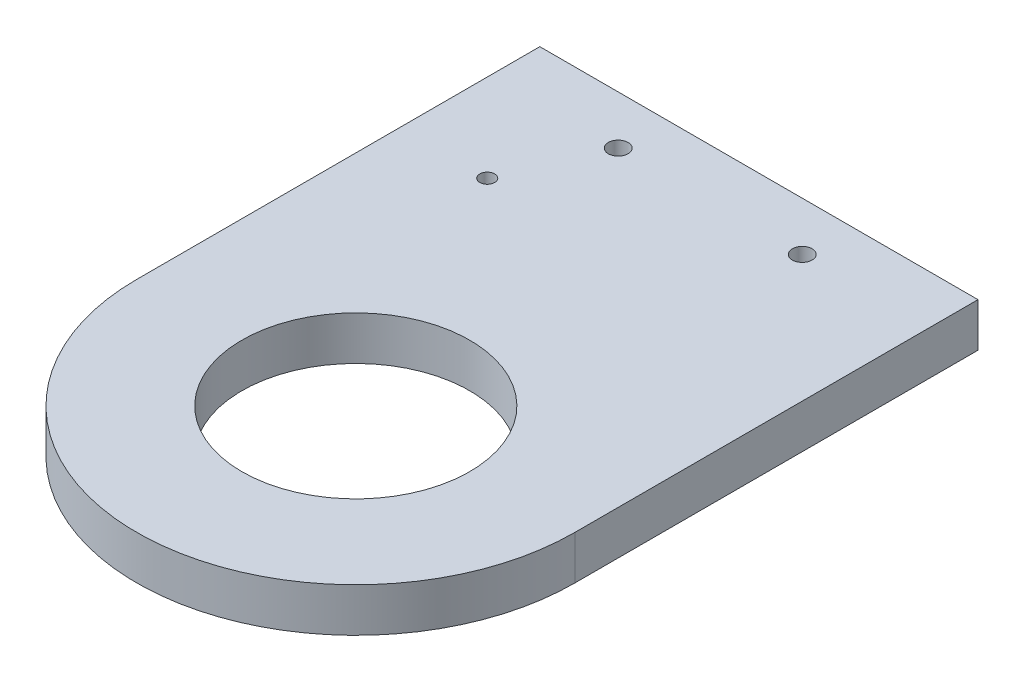
ISO-10303-21;
HEADER;
FILE_DESCRIPTION(('STEP AP214'),'2;1');
FILE_NAME('part.step','',(''),(''),'','','');
FILE_SCHEMA(('AUTOMOTIVE_DESIGN { 1 0 10303 214 1 1 1 1 }'));
ENDSEC;
DATA;
#1=APPLICATION_CONTEXT('core data for automotive mechanical design processes');
#2=APPLICATION_PROTOCOL_DEFINITION('international standard','automotive_design',2000,#1);
#3=PRODUCT_CONTEXT('',#1,'mechanical');
#4=PRODUCT('Part','Part','',(#3));
#5=PRODUCT_RELATED_PRODUCT_CATEGORY('part','',(#4));
#6=PRODUCT_DEFINITION_FORMATION('','',#4);
#7=PRODUCT_DEFINITION_CONTEXT('part definition',#1,'design');
#8=PRODUCT_DEFINITION('design','',#6,#7);
#9=PRODUCT_DEFINITION_SHAPE('','',#8);
#10=(LENGTH_UNIT() NAMED_UNIT(*) SI_UNIT(.MILLI.,.METRE.));
#11=(NAMED_UNIT(*) PLANE_ANGLE_UNIT() SI_UNIT($,.RADIAN.));
#12=(NAMED_UNIT(*) SI_UNIT($,.STERADIAN.) SOLID_ANGLE_UNIT());
#13=UNCERTAINTY_MEASURE_WITH_UNIT(LENGTH_MEASURE(1.E-05),#10,'distance_accuracy_value','');
#14=(GEOMETRIC_REPRESENTATION_CONTEXT(3) GLOBAL_UNCERTAINTY_ASSIGNED_CONTEXT((#13)) GLOBAL_UNIT_ASSIGNED_CONTEXT((#10,
#11,#12)) REPRESENTATION_CONTEXT('',''));
#15=CARTESIAN_POINT('',(0.,0.,0.));
#16=DIRECTION('',(0.,0.,1.));
#17=DIRECTION('',(1.,0.,0.));
#18=AXIS2_PLACEMENT_3D('',#15,#16,#17);
#19=CARTESIAN_POINT('',(50.,39.75,170.));
#20=DIRECTION('',(-1.,0.,0.));
#21=DIRECTION('',(0.,0.,1.));
#22=AXIS2_PLACEMENT_3D('',#19,#20,#21);
#23=PLANE('',#22);
#24=DIRECTION('',(0.,0.,-1.));
#25=VECTOR('',#24,1.);
#26=CARTESIAN_POINT('',(50.,29.75,170.));
#27=LINE('',#26,#25);
#28=CARTESIAN_POINT('',(50.,29.75,170.));
#29=VERTEX_POINT('',#28);
#30=CARTESIAN_POINT('',(50.,29.75,78.));
#31=VERTEX_POINT('',#30);
#32=EDGE_CURVE('E107',#29,#31,#27,.T.);
#33=ORIENTED_EDGE('',*,*,#32,.T.);
#34=DIRECTION('',(0.,-1.,0.));
#35=VECTOR('',#34,1.);
#36=CARTESIAN_POINT('',(50.,39.75,78.));
#37=LINE('',#36,#35);
#38=CARTESIAN_POINT('',(50.,39.75,78.));
#39=VERTEX_POINT('',#38);
#40=EDGE_CURVE('E11',#39,#31,#37,.T.);
#41=ORIENTED_EDGE('',*,*,#40,.F.);
#42=DIRECTION('',(0.,0.,-1.));
#43=VECTOR('',#42,1.);
#44=CARTESIAN_POINT('',(50.,39.75,170.));
#45=LINE('',#44,#43);
#46=CARTESIAN_POINT('',(50.,39.75,170.));
#47=VERTEX_POINT('',#46);
#48=EDGE_CURVE('E58',#47,#39,#45,.T.);
#49=ORIENTED_EDGE('',*,*,#48,.F.);
#50=DIRECTION('',(0.,-1.,0.));
#51=VECTOR('',#50,1.);
#52=CARTESIAN_POINT('',(50.,39.75,170.));
#53=LINE('',#52,#51);
#54=EDGE_CURVE('E77',#47,#29,#53,.T.);
#55=ORIENTED_EDGE('',*,*,#54,.T.);
#56=EDGE_LOOP('',(#33,#41,#49,#55));
#57=FACE_BOUND('',#56,.T.);
#58=ADVANCED_FACE('F43',(#57),#23,.F.);
#59=CARTESIAN_POINT('',(-50.,39.75,78.));
#60=DIRECTION('',(0.,0.,1.));
#61=DIRECTION('',(1.,0.,0.));
#62=AXIS2_PLACEMENT_3D('',#59,#60,#61);
#63=PLANE('',#62);
#64=DIRECTION('',(-1.,0.,0.));
#65=VECTOR('',#64,1.);
#66=CARTESIAN_POINT('',(-50.,29.75,78.));
#67=LINE('',#66,#65);
#68=CARTESIAN_POINT('',(-50.,29.75,78.));
#69=VERTEX_POINT('',#68);
#70=EDGE_CURVE('E74',#31,#69,#67,.T.);
#71=ORIENTED_EDGE('',*,*,#70,.T.);
#72=DIRECTION('',(0.,-1.,0.));
#73=VECTOR('',#72,1.);
#74=CARTESIAN_POINT('',(-50.,39.75,78.));
#75=LINE('',#74,#73);
#76=CARTESIAN_POINT('',(-50.,39.75,78.));
#77=VERTEX_POINT('',#76);
#78=EDGE_CURVE('E55',#77,#69,#75,.T.);
#79=ORIENTED_EDGE('',*,*,#78,.F.);
#80=DIRECTION('',(-1.,0.,0.));
#81=VECTOR('',#80,1.);
#82=CARTESIAN_POINT('',(-50.,39.75,78.));
#83=LINE('',#82,#81);
#84=EDGE_CURVE('E84',#39,#77,#83,.T.);
#85=ORIENTED_EDGE('',*,*,#84,.F.);
#86=ORIENTED_EDGE('',*,*,#40,.T.);
#87=EDGE_LOOP('',(#71,#79,#85,#86));
#88=FACE_BOUND('',#87,.T.);
#89=ADVANCED_FACE('F175',(#88),#63,.F.);
#90=CARTESIAN_POINT('',(-50.,39.75,170.));
#91=DIRECTION('',(1.,0.,0.));
#92=DIRECTION('',(0.,0.,-1.));
#93=AXIS2_PLACEMENT_3D('',#90,#91,#92);
#94=PLANE('',#93);
#95=DIRECTION('',(0.,0.,1.));
#96=VECTOR('',#95,1.);
#97=CARTESIAN_POINT('',(-50.,29.75,170.));
#98=LINE('',#97,#96);
#99=CARTESIAN_POINT('',(-50.,29.75,170.));
#100=VERTEX_POINT('',#99);
#101=EDGE_CURVE('E90',#69,#100,#98,.T.);
#102=ORIENTED_EDGE('',*,*,#101,.T.);
#103=DIRECTION('',(0.,-1.,0.));
#104=VECTOR('',#103,1.);
#105=CARTESIAN_POINT('',(-50.,39.75,170.));
#106=LINE('',#105,#104);
#107=CARTESIAN_POINT('',(-50.,39.75,170.));
#108=VERTEX_POINT('',#107);
#109=EDGE_CURVE('E91',#108,#100,#106,.T.);
#110=ORIENTED_EDGE('',*,*,#109,.F.);
#111=DIRECTION('',(0.,0.,1.));
#112=VECTOR('',#111,1.);
#113=CARTESIAN_POINT('',(-50.,39.75,170.));
#114=LINE('',#113,#112);
#115=EDGE_CURVE('E123',#77,#108,#114,.T.);
#116=ORIENTED_EDGE('',*,*,#115,.F.);
#117=ORIENTED_EDGE('',*,*,#78,.T.);
#118=EDGE_LOOP('',(#102,#110,#116,#117));
#119=FACE_BOUND('',#118,.T.);
#120=ADVANCED_FACE('F93',(#119),#94,.F.);
#121=CARTESIAN_POINT('',(0.,39.75,0.));
#122=DIRECTION('',(0.,-1.,0.));
#123=DIRECTION('',(0.,0.,-1.));
#124=AXIS2_PLACEMENT_3D('',#121,#122,#123);
#125=PLANE('',#124);
#126=CARTESIAN_POINT('',(-30.,39.75,110.));
#127=DIRECTION('',(0.,1.,0.));
#128=DIRECTION('',(0.,0.,1.));
#129=AXIS2_PLACEMENT_3D('',#126,#127,#128);
#130=CIRCLE('',#129,1.7);
#131=CARTESIAN_POINT('',(-30.,39.75,111.7));
#132=VERTEX_POINT('',#131);
#133=EDGE_CURVE('E135',#132,#132,#130,.T.);
#134=ORIENTED_EDGE('',*,*,#133,.F.);
#135=EDGE_LOOP('',(#134));
#136=FACE_BOUND('',#135,.T.);
#137=CARTESIAN_POINT('',(-21.,39.75,89.11));
#138=DIRECTION('',(0.,1.,0.));
#139=DIRECTION('',(0.,0.,1.));
#140=AXIS2_PLACEMENT_3D('',#137,#138,#139);
#141=CIRCLE('',#140,2.25);
#142=CARTESIAN_POINT('',(-21.,39.75,91.36));
#143=VERTEX_POINT('',#142);
#144=EDGE_CURVE('E139',#143,#143,#141,.T.);
#145=ORIENTED_EDGE('',*,*,#144,.F.);
#146=EDGE_LOOP('',(#145));
#147=FACE_BOUND('',#146,.T.);
#148=CARTESIAN_POINT('',(21.,39.75,89.11));
#149=DIRECTION('',(0.,1.,0.));
#150=DIRECTION('',(0.,0.,1.));
#151=AXIS2_PLACEMENT_3D('',#148,#149,#150);
#152=CIRCLE('',#151,2.25);
#153=CARTESIAN_POINT('',(21.,39.75,91.36));
#154=VERTEX_POINT('',#153);
#155=EDGE_CURVE('E145',#154,#154,#152,.T.);
#156=ORIENTED_EDGE('',*,*,#155,.F.);
#157=EDGE_LOOP('',(#156));
#158=FACE_BOUND('',#157,.T.);
#159=CARTESIAN_POINT('',(0.,39.75,170.));
#160=DIRECTION('',(0.,1.,0.));
#161=DIRECTION('',(0.,0.,1.));
#162=AXIS2_PLACEMENT_3D('',#159,#160,#161);
#163=CIRCLE('',#162,26.);
#164=CARTESIAN_POINT('',(0.,39.75,196.));
#165=VERTEX_POINT('',#164);
#166=EDGE_CURVE('E109',#165,#165,#163,.T.);
#167=ORIENTED_EDGE('',*,*,#166,.F.);
#168=EDGE_LOOP('',(#167));
#169=FACE_BOUND('',#168,.T.);
#170=ORIENTED_EDGE('',*,*,#115,.T.);
#171=CARTESIAN_POINT('',(0.,39.75,170.));
#172=DIRECTION('',(0.,1.,0.));
#173=DIRECTION('',(0.,0.,1.));
#174=AXIS2_PLACEMENT_3D('',#171,#172,#173);
#175=CIRCLE('',#174,50.);
#176=EDGE_CURVE('E102',#108,#47,#175,.T.);
#177=ORIENTED_EDGE('',*,*,#176,.T.);
#178=ORIENTED_EDGE('',*,*,#48,.T.);
#179=ORIENTED_EDGE('',*,*,#84,.T.);
#180=EDGE_LOOP('',(#170,#177,#178,#179));
#181=FACE_BOUND('',#180,.T.);
#182=ADVANCED_FACE('F167',(#136,#147,#158,#169,#181),#125,.F.);
#183=CARTESIAN_POINT('',(0.,29.75,0.));
#184=DIRECTION('',(0.,-1.,0.));
#185=DIRECTION('',(0.,0.,-1.));
#186=AXIS2_PLACEMENT_3D('',#183,#184,#185);
#187=PLANE('',#186);
#188=CARTESIAN_POINT('',(-30.,29.75,110.));
#189=DIRECTION('',(0.,1.,0.));
#190=DIRECTION('',(0.,0.,1.));
#191=AXIS2_PLACEMENT_3D('',#188,#189,#190);
#192=CIRCLE('',#191,1.7);
#193=CARTESIAN_POINT('',(-30.,29.75,111.7));
#194=VERTEX_POINT('',#193);
#195=EDGE_CURVE('E140',#194,#194,#192,.T.);
#196=ORIENTED_EDGE('',*,*,#195,.T.);
#197=EDGE_LOOP('',(#196));
#198=FACE_BOUND('',#197,.T.);
#199=CARTESIAN_POINT('',(-21.,29.75,89.11));
#200=DIRECTION('',(0.,1.,0.));
#201=DIRECTION('',(0.,0.,1.));
#202=AXIS2_PLACEMENT_3D('',#199,#200,#201);
#203=CIRCLE('',#202,2.25);
#204=CARTESIAN_POINT('',(-21.,29.75,91.36));
#205=VERTEX_POINT('',#204);
#206=EDGE_CURVE('E155',#205,#205,#203,.T.);
#207=ORIENTED_EDGE('',*,*,#206,.T.);
#208=EDGE_LOOP('',(#207));
#209=FACE_BOUND('',#208,.T.);
#210=CARTESIAN_POINT('',(21.,29.75,89.11));
#211=DIRECTION('',(0.,1.,0.));
#212=DIRECTION('',(0.,0.,1.));
#213=AXIS2_PLACEMENT_3D('',#210,#211,#212);
#214=CIRCLE('',#213,2.25);
#215=CARTESIAN_POINT('',(21.,29.75,91.36));
#216=VERTEX_POINT('',#215);
#217=EDGE_CURVE('E148',#216,#216,#214,.T.);
#218=ORIENTED_EDGE('',*,*,#217,.T.);
#219=EDGE_LOOP('',(#218));
#220=FACE_BOUND('',#219,.T.);
#221=CARTESIAN_POINT('',(0.,29.75,170.));
#222=DIRECTION('',(0.,1.,0.));
#223=DIRECTION('',(0.,0.,1.));
#224=AXIS2_PLACEMENT_3D('',#221,#222,#223);
#225=CIRCLE('',#224,26.);
#226=CARTESIAN_POINT('',(0.,29.75,196.));
#227=VERTEX_POINT('',#226);
#228=EDGE_CURVE('E118',#227,#227,#225,.T.);
#229=ORIENTED_EDGE('',*,*,#228,.T.);
#230=EDGE_LOOP('',(#229));
#231=FACE_BOUND('',#230,.T.);
#232=ORIENTED_EDGE('',*,*,#32,.F.);
#233=CARTESIAN_POINT('',(0.,29.75,170.));
#234=DIRECTION('',(0.,1.,0.));
#235=DIRECTION('',(0.,0.,1.));
#236=AXIS2_PLACEMENT_3D('',#233,#234,#235);
#237=CIRCLE('',#236,50.);
#238=EDGE_CURVE('E105',#100,#29,#237,.T.);
#239=ORIENTED_EDGE('',*,*,#238,.F.);
#240=ORIENTED_EDGE('',*,*,#101,.F.);
#241=ORIENTED_EDGE('',*,*,#70,.F.);
#242=EDGE_LOOP('',(#232,#239,#240,#241));
#243=FACE_BOUND('',#242,.T.);
#244=ADVANCED_FACE('F110',(#198,#209,#220,#231,#243),#187,.T.);
#245=CARTESIAN_POINT('',(0.,39.75,170.));
#246=DIRECTION('',(0.,-1.,0.));
#247=DIRECTION('',(0.,0.,-1.));
#248=AXIS2_PLACEMENT_3D('',#245,#246,#247);
#249=CYLINDRICAL_SURFACE('',#248,50.);
#250=ORIENTED_EDGE('',*,*,#238,.T.);
#251=ORIENTED_EDGE('',*,*,#54,.F.);
#252=ORIENTED_EDGE('',*,*,#176,.F.);
#253=ORIENTED_EDGE('',*,*,#109,.T.);
#254=EDGE_LOOP('',(#250,#251,#252,#253));
#255=FACE_BOUND('',#254,.T.);
#256=ADVANCED_FACE('F101',(#255),#249,.T.);
#257=CARTESIAN_POINT('',(0.,39.75,170.));
#258=DIRECTION('',(0.,-1.,0.));
#259=DIRECTION('',(0.,0.,-1.));
#260=AXIS2_PLACEMENT_3D('',#257,#258,#259);
#261=CYLINDRICAL_SURFACE('',#260,26.);
#262=ORIENTED_EDGE('',*,*,#166,.T.);
#263=EDGE_LOOP('',(#262));
#264=FACE_BOUND('',#263,.T.);
#265=ORIENTED_EDGE('',*,*,#228,.F.);
#266=EDGE_LOOP('',(#265));
#267=FACE_BOUND('',#266,.T.);
#268=ADVANCED_FACE('F188',(#264,#267),#261,.F.);
#269=CARTESIAN_POINT('',(21.,39.75,89.11));
#270=DIRECTION('',(0.,-1.,0.));
#271=DIRECTION('',(0.,0.,-1.));
#272=AXIS2_PLACEMENT_3D('',#269,#270,#271);
#273=CYLINDRICAL_SURFACE('',#272,2.25);
#274=ORIENTED_EDGE('',*,*,#155,.T.);
#275=EDGE_LOOP('',(#274));
#276=FACE_BOUND('',#275,.T.);
#277=ORIENTED_EDGE('',*,*,#217,.F.);
#278=EDGE_LOOP('',(#277));
#279=FACE_BOUND('',#278,.T.);
#280=ADVANCED_FACE('F190',(#276,#279),#273,.F.);
#281=CARTESIAN_POINT('',(-21.,39.75,89.11));
#282=DIRECTION('',(0.,-1.,0.));
#283=DIRECTION('',(0.,0.,-1.));
#284=AXIS2_PLACEMENT_3D('',#281,#282,#283);
#285=CYLINDRICAL_SURFACE('',#284,2.25);
#286=ORIENTED_EDGE('',*,*,#144,.T.);
#287=EDGE_LOOP('',(#286));
#288=FACE_BOUND('',#287,.T.);
#289=ORIENTED_EDGE('',*,*,#206,.F.);
#290=EDGE_LOOP('',(#289));
#291=FACE_BOUND('',#290,.T.);
#292=ADVANCED_FACE('F162',(#288,#291),#285,.F.);
#293=CARTESIAN_POINT('',(-30.,39.75,110.));
#294=DIRECTION('',(0.,-1.,0.));
#295=DIRECTION('',(0.,0.,-1.));
#296=AXIS2_PLACEMENT_3D('',#293,#294,#295);
#297=CYLINDRICAL_SURFACE('',#296,1.7);
#298=ORIENTED_EDGE('',*,*,#133,.T.);
#299=EDGE_LOOP('',(#298));
#300=FACE_BOUND('',#299,.T.);
#301=ORIENTED_EDGE('',*,*,#195,.F.);
#302=EDGE_LOOP('',(#301));
#303=FACE_BOUND('',#302,.T.);
#304=ADVANCED_FACE('F195',(#300,#303),#297,.F.);
#305=CLOSED_SHELL('',(#58,#89,#120,#182,#244,#256,#268,#280,#292,#304));
#306=MANIFOLD_SOLID_BREP('B2',#305);
#307=ADVANCED_BREP_SHAPE_REPRESENTATION('',(#18,#306),#14);
#308=SHAPE_DEFINITION_REPRESENTATION(#9,#307);
ENDSEC;
END-ISO-10303-21;
